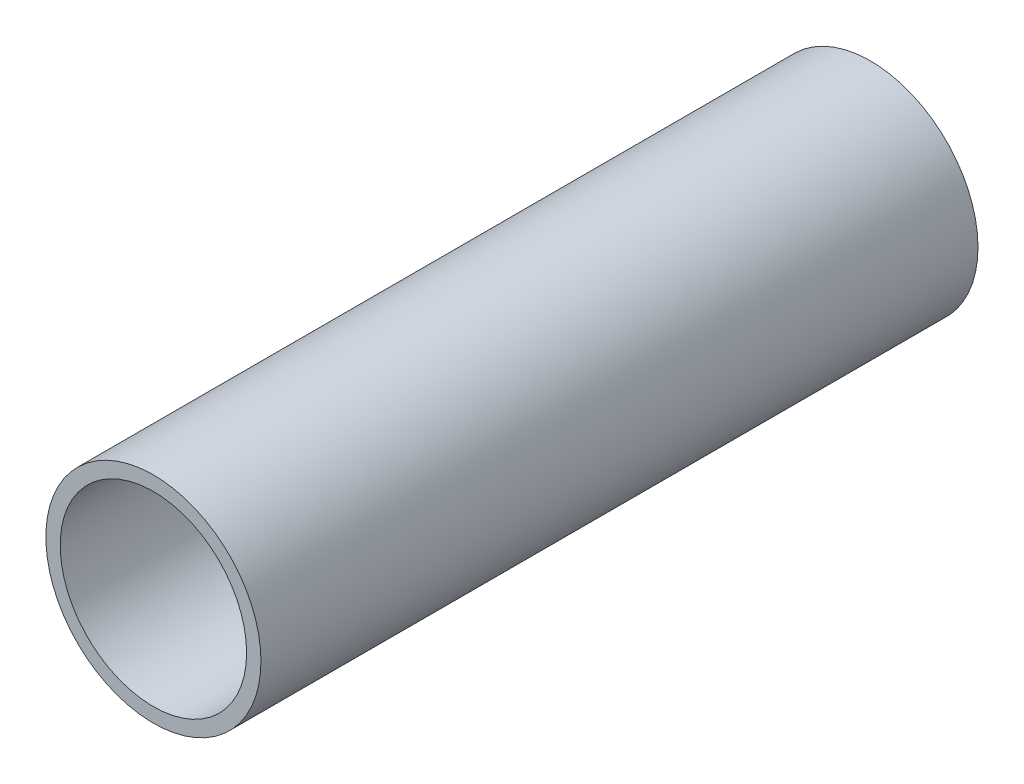
ISO-10303-21;
HEADER;
FILE_DESCRIPTION(('STEP AP214'),'2;1');
FILE_NAME('part.step','',(''),(''),'','','');
FILE_SCHEMA(('AUTOMOTIVE_DESIGN { 1 0 10303 214 1 1 1 1 }'));
ENDSEC;
DATA;
#1=APPLICATION_CONTEXT('core data for automotive mechanical design processes');
#2=APPLICATION_PROTOCOL_DEFINITION('international standard','automotive_design',2000,#1);
#3=PRODUCT_CONTEXT('',#1,'mechanical');
#4=PRODUCT('Part','Part','',(#3));
#5=PRODUCT_RELATED_PRODUCT_CATEGORY('part','',(#4));
#6=PRODUCT_DEFINITION_FORMATION('','',#4);
#7=PRODUCT_DEFINITION_CONTEXT('part definition',#1,'design');
#8=PRODUCT_DEFINITION('design','',#6,#7);
#9=PRODUCT_DEFINITION_SHAPE('','',#8);
#10=(LENGTH_UNIT() NAMED_UNIT(*) SI_UNIT(.MILLI.,.METRE.));
#11=(NAMED_UNIT(*) PLANE_ANGLE_UNIT() SI_UNIT($,.RADIAN.));
#12=(NAMED_UNIT(*) SI_UNIT($,.STERADIAN.) SOLID_ANGLE_UNIT());
#13=UNCERTAINTY_MEASURE_WITH_UNIT(LENGTH_MEASURE(1.E-05),#10,'distance_accuracy_value','');
#14=(GEOMETRIC_REPRESENTATION_CONTEXT(3) GLOBAL_UNCERTAINTY_ASSIGNED_CONTEXT((#13)) GLOBAL_UNIT_ASSIGNED_CONTEXT((#10,
#11,#12)) REPRESENTATION_CONTEXT('',''));
#15=CARTESIAN_POINT('',(0.,0.,0.));
#16=DIRECTION('',(0.,0.,1.));
#17=DIRECTION('',(1.,0.,0.));
#18=AXIS2_PLACEMENT_3D('',#15,#16,#17);
#19=CARTESIAN_POINT('',(0.,0.,150.));
#20=DIRECTION('',(0.,0.,1.));
#21=DIRECTION('',(1.,0.,0.));
#22=AXIS2_PLACEMENT_3D('',#19,#20,#21);
#23=PLANE('',#22);
#24=CARTESIAN_POINT('',(0.,0.,150.));
#25=DIRECTION('',(0.,0.,1.));
#26=DIRECTION('',(1.,0.,0.));
#27=AXIS2_PLACEMENT_3D('',#24,#25,#26);
#28=CIRCLE('',#27,22.5);
#29=CARTESIAN_POINT('',(22.5,0.,150.));
#30=VERTEX_POINT('',#29);
#31=EDGE_CURVE('E10',#30,#30,#28,.T.);
#32=ORIENTED_EDGE('',*,*,#31,.T.);
#33=EDGE_LOOP('',(#32));
#34=FACE_BOUND('',#33,.T.);
#35=CARTESIAN_POINT('',(0.,0.,150.));
#36=DIRECTION('',(0.,0.,1.));
#37=DIRECTION('',(1.,0.,0.));
#38=AXIS2_PLACEMENT_3D('',#35,#36,#37);
#39=CIRCLE('',#38,19.5);
#40=CARTESIAN_POINT('',(19.5,0.,150.));
#41=VERTEX_POINT('',#40);
#42=EDGE_CURVE('E42',#41,#41,#39,.T.);
#43=ORIENTED_EDGE('',*,*,#42,.F.);
#44=EDGE_LOOP('',(#43));
#45=FACE_BOUND('',#44,.T.);
#46=ADVANCED_FACE('F31',(#34,#45),#23,.T.);
#47=CARTESIAN_POINT('',(0.,0.,0.));
#48=DIRECTION('',(0.,0.,1.));
#49=DIRECTION('',(1.,0.,0.));
#50=AXIS2_PLACEMENT_3D('',#47,#48,#49);
#51=PLANE('',#50);
#52=CARTESIAN_POINT('',(0.,0.,0.));
#53=DIRECTION('',(0.,0.,1.));
#54=DIRECTION('',(1.,0.,0.));
#55=AXIS2_PLACEMENT_3D('',#52,#53,#54);
#56=CIRCLE('',#55,22.5);
#57=CARTESIAN_POINT('',(22.5,0.,0.));
#58=VERTEX_POINT('',#57);
#59=EDGE_CURVE('E35',#58,#58,#56,.T.);
#60=ORIENTED_EDGE('',*,*,#59,.F.);
#61=EDGE_LOOP('',(#60));
#62=FACE_BOUND('',#61,.T.);
#63=CARTESIAN_POINT('',(0.,0.,0.));
#64=DIRECTION('',(0.,0.,1.));
#65=DIRECTION('',(1.,0.,0.));
#66=AXIS2_PLACEMENT_3D('',#63,#64,#65);
#67=CIRCLE('',#66,19.5);
#68=CARTESIAN_POINT('',(19.5,0.,0.));
#69=VERTEX_POINT('',#68);
#70=EDGE_CURVE('E44',#69,#69,#67,.T.);
#71=ORIENTED_EDGE('',*,*,#70,.T.);
#72=EDGE_LOOP('',(#71));
#73=FACE_BOUND('',#72,.T.);
#74=ADVANCED_FACE('F54',(#62,#73),#51,.F.);
#75=CARTESIAN_POINT('',(0.,0.,150.));
#76=DIRECTION('',(0.,0.,-1.));
#77=DIRECTION('',(-1.,0.,0.));
#78=AXIS2_PLACEMENT_3D('',#75,#76,#77);
#79=CYLINDRICAL_SURFACE('',#78,22.5);
#80=ORIENTED_EDGE('',*,*,#31,.F.);
#81=EDGE_LOOP('',(#80));
#82=FACE_BOUND('',#81,.T.);
#83=ORIENTED_EDGE('',*,*,#59,.T.);
#84=EDGE_LOOP('',(#83));
#85=FACE_BOUND('',#84,.T.);
#86=ADVANCED_FACE('F33',(#82,#85),#79,.T.);
#87=CARTESIAN_POINT('',(0.,0.,150.));
#88=DIRECTION('',(0.,0.,-1.));
#89=DIRECTION('',(-1.,0.,0.));
#90=AXIS2_PLACEMENT_3D('',#87,#88,#89);
#91=CYLINDRICAL_SURFACE('',#90,19.5);
#92=ORIENTED_EDGE('',*,*,#42,.T.);
#93=EDGE_LOOP('',(#92));
#94=FACE_BOUND('',#93,.T.);
#95=ORIENTED_EDGE('',*,*,#70,.F.);
#96=EDGE_LOOP('',(#95));
#97=FACE_BOUND('',#96,.T.);
#98=ADVANCED_FACE('F50',(#94,#97),#91,.F.);
#99=CLOSED_SHELL('',(#46,#74,#86,#98));
#100=MANIFOLD_SOLID_BREP('B2',#99);
#101=ADVANCED_BREP_SHAPE_REPRESENTATION('',(#18,#100),#14);
#102=SHAPE_DEFINITION_REPRESENTATION(#9,#101);
ENDSEC;
END-ISO-10303-21;
